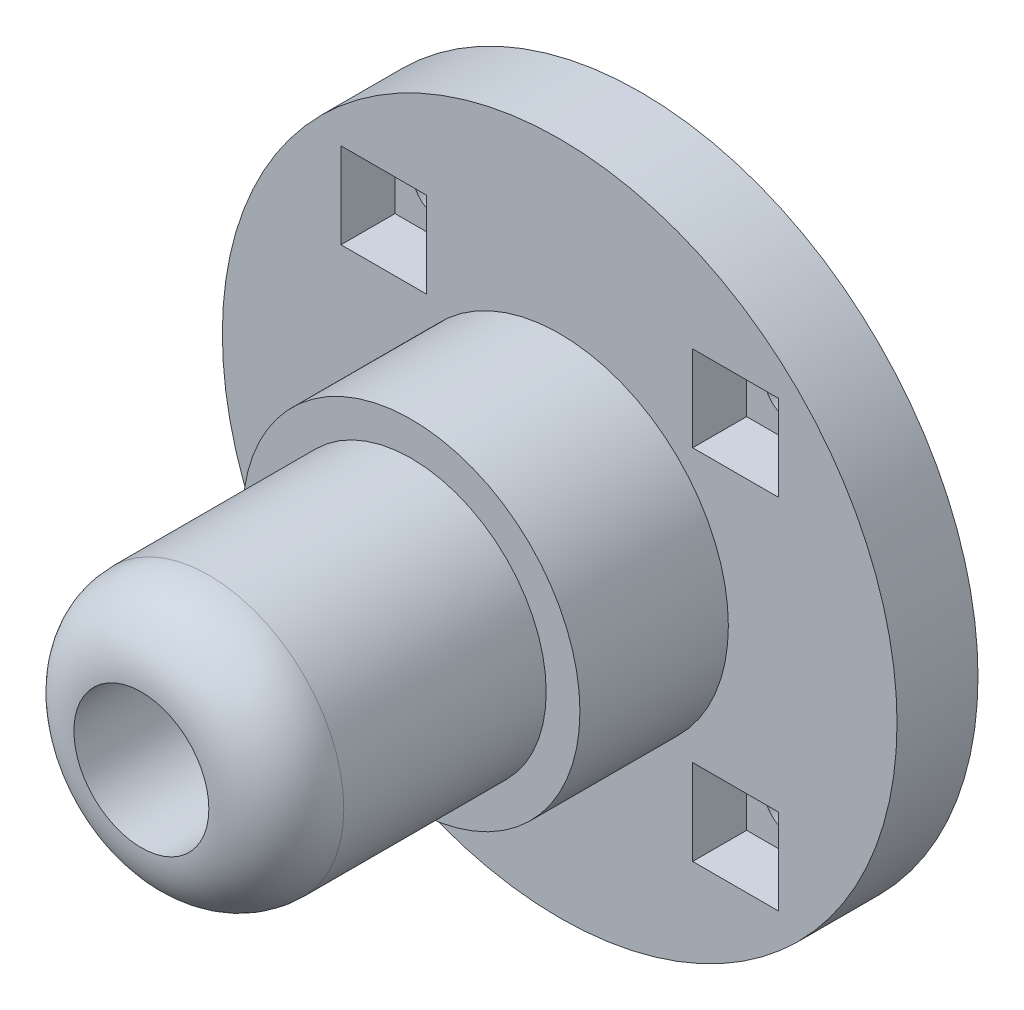
ISO-10303-21;
HEADER;
FILE_DESCRIPTION(('STEP AP214'),'2;1');
FILE_NAME('part.step','',(''),(''),'','','');
FILE_SCHEMA(('AUTOMOTIVE_DESIGN { 1 0 10303 214 1 1 1 1 }'));
ENDSEC;
DATA;
#1=APPLICATION_CONTEXT('core data for automotive mechanical design processes');
#2=APPLICATION_PROTOCOL_DEFINITION('international standard','automotive_design',2000,#1);
#3=PRODUCT_CONTEXT('',#1,'mechanical');
#4=PRODUCT('Part','Part','',(#3));
#5=PRODUCT_RELATED_PRODUCT_CATEGORY('part','',(#4));
#6=PRODUCT_DEFINITION_FORMATION('','',#4);
#7=PRODUCT_DEFINITION_CONTEXT('part definition',#1,'design');
#8=PRODUCT_DEFINITION('design','',#6,#7);
#9=PRODUCT_DEFINITION_SHAPE('','',#8);
#10=(LENGTH_UNIT() NAMED_UNIT(*) SI_UNIT(.MILLI.,.METRE.));
#11=(NAMED_UNIT(*) PLANE_ANGLE_UNIT() SI_UNIT($,.RADIAN.));
#12=(NAMED_UNIT(*) SI_UNIT($,.STERADIAN.) SOLID_ANGLE_UNIT());
#13=UNCERTAINTY_MEASURE_WITH_UNIT(LENGTH_MEASURE(1.E-05),#10,'distance_accuracy_value','');
#14=(GEOMETRIC_REPRESENTATION_CONTEXT(3) GLOBAL_UNCERTAINTY_ASSIGNED_CONTEXT((#13)) GLOBAL_UNIT_ASSIGNED_CONTEXT((#10,
#11,#12)) REPRESENTATION_CONTEXT('',''));
#15=CARTESIAN_POINT('',(0.,0.,0.));
#16=DIRECTION('',(0.,0.,1.));
#17=DIRECTION('',(1.,0.,0.));
#18=AXIS2_PLACEMENT_3D('',#15,#16,#17);
#19=CARTESIAN_POINT('',(-13.0294986716924,-13.2747984248508,6.));
#20=DIRECTION('',(0.,0.,-1.));
#21=DIRECTION('',(-1.,0.,0.));
#22=AXIS2_PLACEMENT_3D('',#19,#20,#21);
#23=CYLINDRICAL_SURFACE('',#22,1.85);
#24=CARTESIAN_POINT('',(-13.0294986716924,-13.2747984248508,0.));
#25=DIRECTION('',(0.,0.,1.));
#26=DIRECTION('',(1.,0.,0.));
#27=AXIS2_PLACEMENT_3D('',#24,#25,#26);
#28=CIRCLE('',#27,1.85);
#29=CARTESIAN_POINT('',(-11.1794986716924,-13.2747984248508,0.));
#30=VERTEX_POINT('',#29);
#31=EDGE_CURVE('E328',#30,#30,#28,.T.);
#32=ORIENTED_EDGE('',*,*,#31,.F.);
#33=EDGE_LOOP('',(#32));
#34=FACE_BOUND('',#33,.T.);
#35=CARTESIAN_POINT('',(-13.0294986716924,-13.2747984248508,2.));
#36=DIRECTION('',(0.,0.,1.));
#37=DIRECTION('',(1.,0.,0.));
#38=AXIS2_PLACEMENT_3D('',#35,#36,#37);
#39=CIRCLE('',#38,1.85);
#40=CARTESIAN_POINT('',(-11.1794986716924,-13.2747984248508,2.));
#41=VERTEX_POINT('',#40);
#42=EDGE_CURVE('E67',#41,#41,#39,.T.);
#43=ORIENTED_EDGE('',*,*,#42,.T.);
#44=EDGE_LOOP('',(#43));
#45=FACE_BOUND('',#44,.T.);
#46=ADVANCED_FACE('F63',(#34,#45),#23,.F.);
#47=CARTESIAN_POINT('',(13.0294986716924,13.2747984248508,6.));
#48=DIRECTION('',(0.,0.,-1.));
#49=DIRECTION('',(-1.,0.,0.));
#50=AXIS2_PLACEMENT_3D('',#47,#48,#49);
#51=CYLINDRICAL_SURFACE('',#50,1.85);
#52=CARTESIAN_POINT('',(13.0294986716924,13.2747984248508,0.));
#53=DIRECTION('',(0.,0.,1.));
#54=DIRECTION('',(1.,0.,0.));
#55=AXIS2_PLACEMENT_3D('',#52,#53,#54);
#56=CIRCLE('',#55,1.85);
#57=CARTESIAN_POINT('',(14.8794986716924,13.2747984248508,0.));
#58=VERTEX_POINT('',#57);
#59=EDGE_CURVE('E334',#58,#58,#56,.T.);
#60=ORIENTED_EDGE('',*,*,#59,.F.);
#61=EDGE_LOOP('',(#60));
#62=FACE_BOUND('',#61,.T.);
#63=CARTESIAN_POINT('',(13.0294986716924,13.2747984248508,2.));
#64=DIRECTION('',(0.,0.,1.));
#65=DIRECTION('',(1.,0.,0.));
#66=AXIS2_PLACEMENT_3D('',#63,#64,#65);
#67=CIRCLE('',#66,1.85);
#68=CARTESIAN_POINT('',(14.8794986716924,13.2747984248508,2.));
#69=VERTEX_POINT('',#68);
#70=EDGE_CURVE('E273',#69,#69,#67,.T.);
#71=ORIENTED_EDGE('',*,*,#70,.T.);
#72=EDGE_LOOP('',(#71));
#73=FACE_BOUND('',#72,.T.);
#74=ADVANCED_FACE('F395',(#62,#73),#51,.F.);
#75=CARTESIAN_POINT('',(0.,0.,17.));
#76=DIRECTION('',(0.,0.,1.));
#77=DIRECTION('',(1.,0.,0.));
#78=AXIS2_PLACEMENT_3D('',#75,#76,#77);
#79=PLANE('',#78);
#80=CARTESIAN_POINT('',(0.,0.,17.));
#81=DIRECTION('',(0.,0.,1.));
#82=DIRECTION('',(1.,0.,0.));
#83=AXIS2_PLACEMENT_3D('',#80,#81,#82);
#84=CIRCLE('',#83,12.5);
#85=CARTESIAN_POINT('',(12.5,0.,17.));
#86=VERTEX_POINT('',#85);
#87=EDGE_CURVE('E320',#86,#86,#84,.T.);
#88=ORIENTED_EDGE('',*,*,#87,.T.);
#89=EDGE_LOOP('',(#88));
#90=FACE_BOUND('',#89,.T.);
#91=CARTESIAN_POINT('',(0.,0.,17.));
#92=DIRECTION('',(0.,0.,1.));
#93=DIRECTION('',(1.,0.,0.));
#94=AXIS2_PLACEMENT_3D('',#91,#92,#93);
#95=CIRCLE('',#94,10.);
#96=CARTESIAN_POINT('',(10.,0.,17.));
#97=VERTEX_POINT('',#96);
#98=EDGE_CURVE('E316',#97,#97,#95,.T.);
#99=ORIENTED_EDGE('',*,*,#98,.F.);
#100=EDGE_LOOP('',(#99));
#101=FACE_BOUND('',#100,.T.);
#102=ADVANCED_FACE('F401',(#90,#101),#79,.T.);
#103=CARTESIAN_POINT('',(0.,0.,6.));
#104=DIRECTION('',(0.,0.,1.));
#105=DIRECTION('',(1.,0.,0.));
#106=AXIS2_PLACEMENT_3D('',#103,#104,#105);
#107=PLANE('',#106);
#108=DIRECTION('',(0.,-1.,0.));
#109=VECTOR('',#108,1.);
#110=CARTESIAN_POINT('',(-16.2044986716924,-10.0997984248508,6.));
#111=LINE('',#110,#109);
#112=CARTESIAN_POINT('',(-16.2044986716924,-10.0997984248508,6.));
#113=VERTEX_POINT('',#112);
#114=CARTESIAN_POINT('',(-16.2044986716924,-16.4497984248508,6.));
#115=VERTEX_POINT('',#114);
#116=EDGE_CURVE('E80',#113,#115,#111,.T.);
#117=ORIENTED_EDGE('',*,*,#116,.F.);
#118=DIRECTION('',(-1.,0.,0.));
#119=VECTOR('',#118,1.);
#120=CARTESIAN_POINT('',(-16.2044986716924,-10.0997984248508,6.));
#121=LINE('',#120,#119);
#122=CARTESIAN_POINT('',(-9.85449867169244,-10.0997984248508,6.));
#123=VERTEX_POINT('',#122);
#124=EDGE_CURVE('E198',#123,#113,#121,.T.);
#125=ORIENTED_EDGE('',*,*,#124,.F.);
#126=DIRECTION('',(0.,1.,0.));
#127=VECTOR('',#126,1.);
#128=CARTESIAN_POINT('',(-9.85449867169244,-10.0997984248508,6.));
#129=LINE('',#128,#127);
#130=CARTESIAN_POINT('',(-9.85449867169244,-16.4497984248508,6.));
#131=VERTEX_POINT('',#130);
#132=EDGE_CURVE('E201',#131,#123,#129,.T.);
#133=ORIENTED_EDGE('',*,*,#132,.F.);
#134=DIRECTION('',(1.,0.,0.));
#135=VECTOR('',#134,1.);
#136=CARTESIAN_POINT('',(-16.2044986716924,-16.4497984248508,6.));
#137=LINE('',#136,#135);
#138=EDGE_CURVE('E207',#115,#131,#137,.T.);
#139=ORIENTED_EDGE('',*,*,#138,.F.);
#140=EDGE_LOOP('',(#117,#125,#133,#139));
#141=FACE_BOUND('',#140,.T.);
#142=DIRECTION('',(0.,-1.,0.));
#143=VECTOR('',#142,1.);
#144=CARTESIAN_POINT('',(-16.2044986716924,10.0997984248508,6.));
#145=LINE('',#144,#143);
#146=CARTESIAN_POINT('',(-16.2044986716924,16.4497984248508,6.));
#147=VERTEX_POINT('',#146);
#148=CARTESIAN_POINT('',(-16.2044986716924,10.0997984248508,6.));
#149=VERTEX_POINT('',#148);
#150=EDGE_CURVE('E88',#147,#149,#145,.T.);
#151=ORIENTED_EDGE('',*,*,#150,.F.);
#152=DIRECTION('',(-1.,0.,0.));
#153=VECTOR('',#152,1.);
#154=CARTESIAN_POINT('',(-16.2044986716924,16.4497984248508,6.));
#155=LINE('',#154,#153);
#156=CARTESIAN_POINT('',(-9.85449867169244,16.4497984248508,6.));
#157=VERTEX_POINT('',#156);
#158=EDGE_CURVE('E220',#157,#147,#155,.T.);
#159=ORIENTED_EDGE('',*,*,#158,.F.);
#160=DIRECTION('',(0.,1.,0.));
#161=VECTOR('',#160,1.);
#162=CARTESIAN_POINT('',(-9.85449867169244,10.0997984248508,6.));
#163=LINE('',#162,#161);
#164=CARTESIAN_POINT('',(-9.85449867169244,10.0997984248508,6.));
#165=VERTEX_POINT('',#164);
#166=EDGE_CURVE('E234',#165,#157,#163,.T.);
#167=ORIENTED_EDGE('',*,*,#166,.F.);
#168=DIRECTION('',(1.,0.,0.));
#169=VECTOR('',#168,1.);
#170=CARTESIAN_POINT('',(-16.2044986716924,10.0997984248508,6.));
#171=LINE('',#170,#169);
#172=EDGE_CURVE('E231',#149,#165,#171,.T.);
#173=ORIENTED_EDGE('',*,*,#172,.F.);
#174=EDGE_LOOP('',(#151,#159,#167,#173));
#175=FACE_BOUND('',#174,.T.);
#176=DIRECTION('',(0.,1.,0.));
#177=VECTOR('',#176,1.);
#178=CARTESIAN_POINT('',(16.2044986716924,10.0997984248508,6.));
#179=LINE('',#178,#177);
#180=CARTESIAN_POINT('',(16.2044986716924,10.0997984248508,6.));
#181=VERTEX_POINT('',#180);
#182=CARTESIAN_POINT('',(16.2044986716924,16.4497984248508,6.));
#183=VERTEX_POINT('',#182);
#184=EDGE_CURVE('E261',#181,#183,#179,.T.);
#185=ORIENTED_EDGE('',*,*,#184,.F.);
#186=DIRECTION('',(1.,0.,0.));
#187=VECTOR('',#186,1.);
#188=CARTESIAN_POINT('',(16.2044986716924,10.0997984248508,6.));
#189=LINE('',#188,#187);
#190=CARTESIAN_POINT('',(9.85449867169244,10.0997984248508,6.));
#191=VERTEX_POINT('',#190);
#192=EDGE_CURVE('E251',#191,#181,#189,.T.);
#193=ORIENTED_EDGE('',*,*,#192,.F.);
#194=DIRECTION('',(0.,-1.,0.));
#195=VECTOR('',#194,1.);
#196=CARTESIAN_POINT('',(9.85449867169244,10.0997984248508,6.));
#197=LINE('',#196,#195);
#198=CARTESIAN_POINT('',(9.85449867169244,16.4497984248508,6.));
#199=VERTEX_POINT('',#198);
#200=EDGE_CURVE('E266',#199,#191,#197,.T.);
#201=ORIENTED_EDGE('',*,*,#200,.F.);
#202=DIRECTION('',(-1.,0.,0.));
#203=VECTOR('',#202,1.);
#204=CARTESIAN_POINT('',(16.2044986716924,16.4497984248508,6.));
#205=LINE('',#204,#203);
#206=EDGE_CURVE('E263',#183,#199,#205,.T.);
#207=ORIENTED_EDGE('',*,*,#206,.F.);
#208=EDGE_LOOP('',(#185,#193,#201,#207));
#209=FACE_BOUND('',#208,.T.);
#210=DIRECTION('',(0.,-1.,0.));
#211=VECTOR('',#210,1.);
#212=CARTESIAN_POINT('',(9.85449867169244,-10.0997984248508,6.));
#213=LINE('',#212,#211);
#214=CARTESIAN_POINT('',(9.85449867169244,-10.0997984248508,6.));
#215=VERTEX_POINT('',#214);
#216=CARTESIAN_POINT('',(9.85449867169244,-16.4497984248508,6.));
#217=VERTEX_POINT('',#216);
#218=EDGE_CURVE('E294',#215,#217,#213,.T.);
#219=ORIENTED_EDGE('',*,*,#218,.F.);
#220=DIRECTION('',(-1.,0.,0.));
#221=VECTOR('',#220,1.);
#222=CARTESIAN_POINT('',(16.2044986716924,-10.0997984248508,6.));
#223=LINE('',#222,#221);
#224=CARTESIAN_POINT('',(16.2044986716924,-10.0997984248508,6.));
#225=VERTEX_POINT('',#224);
#226=EDGE_CURVE('E284',#225,#215,#223,.T.);
#227=ORIENTED_EDGE('',*,*,#226,.F.);
#228=DIRECTION('',(0.,1.,0.));
#229=VECTOR('',#228,1.);
#230=CARTESIAN_POINT('',(16.2044986716924,-10.0997984248508,6.));
#231=LINE('',#230,#229);
#232=CARTESIAN_POINT('',(16.2044986716924,-16.4497984248508,6.));
#233=VERTEX_POINT('',#232);
#234=EDGE_CURVE('E299',#233,#225,#231,.T.);
#235=ORIENTED_EDGE('',*,*,#234,.F.);
#236=DIRECTION('',(1.,0.,0.));
#237=VECTOR('',#236,1.);
#238=CARTESIAN_POINT('',(16.2044986716924,-16.4497984248508,6.));
#239=LINE('',#238,#237);
#240=EDGE_CURVE('E296',#217,#233,#239,.T.);
#241=ORIENTED_EDGE('',*,*,#240,.F.);
#242=EDGE_LOOP('',(#219,#227,#235,#241));
#243=FACE_BOUND('',#242,.T.);
#244=CARTESIAN_POINT('',(0.,0.,6.));
#245=DIRECTION('',(0.,0.,1.));
#246=DIRECTION('',(1.,0.,0.));
#247=AXIS2_PLACEMENT_3D('',#244,#245,#246);
#248=CIRCLE('',#247,24.9999999999998);
#249=CARTESIAN_POINT('',(24.9999999999998,0.,6.));
#250=VERTEX_POINT('',#249);
#251=EDGE_CURVE('E72',#250,#250,#248,.T.);
#252=ORIENTED_EDGE('',*,*,#251,.T.);
#253=EDGE_LOOP('',(#252));
#254=FACE_BOUND('',#253,.T.);
#255=CARTESIAN_POINT('',(0.,0.,6.));
#256=DIRECTION('',(0.,0.,1.));
#257=DIRECTION('',(1.,0.,0.));
#258=AXIS2_PLACEMENT_3D('',#255,#256,#257);
#259=CIRCLE('',#258,12.5);
#260=CARTESIAN_POINT('',(12.5,0.,6.));
#261=VERTEX_POINT('',#260);
#262=EDGE_CURVE('E319',#261,#261,#259,.T.);
#263=ORIENTED_EDGE('',*,*,#262,.F.);
#264=EDGE_LOOP('',(#263));
#265=FACE_BOUND('',#264,.T.);
#266=ADVANCED_FACE('F366',(#141,#175,#209,#243,#254,#265),#107,.T.);
#267=CARTESIAN_POINT('',(0.,0.,0.));
#268=DIRECTION('',(0.,0.,1.));
#269=DIRECTION('',(1.,0.,0.));
#270=AXIS2_PLACEMENT_3D('',#267,#268,#269);
#271=PLANE('',#270);
#272=CARTESIAN_POINT('',(0.,0.,0.));
#273=DIRECTION('',(0.,0.,1.));
#274=DIRECTION('',(1.,0.,0.));
#275=AXIS2_PLACEMENT_3D('',#272,#273,#274);
#276=CIRCLE('',#275,24.9999999999998);
#277=CARTESIAN_POINT('',(24.9999999999998,0.,0.));
#278=VERTEX_POINT('',#277);
#279=EDGE_CURVE('E340',#278,#278,#276,.T.);
#280=ORIENTED_EDGE('',*,*,#279,.F.);
#281=EDGE_LOOP('',(#280));
#282=FACE_BOUND('',#281,.T.);
#283=CARTESIAN_POINT('',(13.0294986716924,-13.2747984248508,0.));
#284=DIRECTION('',(0.,0.,1.));
#285=DIRECTION('',(1.,0.,0.));
#286=AXIS2_PLACEMENT_3D('',#283,#284,#285);
#287=CIRCLE('',#286,1.85);
#288=CARTESIAN_POINT('',(14.8794986716924,-13.2747984248508,0.));
#289=VERTEX_POINT('',#288);
#290=EDGE_CURVE('E337',#289,#289,#287,.T.);
#291=ORIENTED_EDGE('',*,*,#290,.T.);
#292=EDGE_LOOP('',(#291));
#293=FACE_BOUND('',#292,.T.);
#294=ORIENTED_EDGE('',*,*,#59,.T.);
#295=EDGE_LOOP('',(#294));
#296=FACE_BOUND('',#295,.T.);
#297=CARTESIAN_POINT('',(-13.0294986716924,13.2747984248508,0.));
#298=DIRECTION('',(0.,0.,1.));
#299=DIRECTION('',(1.,0.,0.));
#300=AXIS2_PLACEMENT_3D('',#297,#298,#299);
#301=CIRCLE('',#300,1.85);
#302=CARTESIAN_POINT('',(-11.1794986716924,13.2747984248508,0.));
#303=VERTEX_POINT('',#302);
#304=EDGE_CURVE('E331',#303,#303,#301,.T.);
#305=ORIENTED_EDGE('',*,*,#304,.T.);
#306=EDGE_LOOP('',(#305));
#307=FACE_BOUND('',#306,.T.);
#308=ORIENTED_EDGE('',*,*,#31,.T.);
#309=EDGE_LOOP('',(#308));
#310=FACE_BOUND('',#309,.T.);
#311=CARTESIAN_POINT('',(0.,0.,0.));
#312=DIRECTION('',(0.,0.,1.));
#313=DIRECTION('',(1.,0.,0.));
#314=AXIS2_PLACEMENT_3D('',#311,#312,#313);
#315=CIRCLE('',#314,5.);
#316=CARTESIAN_POINT('',(5.,0.,0.));
#317=VERTEX_POINT('',#316);
#318=EDGE_CURVE('E323',#317,#317,#315,.T.);
#319=ORIENTED_EDGE('',*,*,#318,.T.);
#320=EDGE_LOOP('',(#319));
#321=FACE_BOUND('',#320,.T.);
#322=ADVANCED_FACE('F362',(#282,#293,#296,#307,#310,#321),#271,.F.);
#323=CARTESIAN_POINT('',(0.,0.,6.));
#324=DIRECTION('',(0.,0.,-1.));
#325=DIRECTION('',(-1.,0.,0.));
#326=AXIS2_PLACEMENT_3D('',#323,#324,#325);
#327=CYLINDRICAL_SURFACE('',#326,24.9999999999998);
#328=ORIENTED_EDGE('',*,*,#251,.F.);
#329=EDGE_LOOP('',(#328));
#330=FACE_BOUND('',#329,.T.);
#331=ORIENTED_EDGE('',*,*,#279,.T.);
#332=EDGE_LOOP('',(#331));
#333=FACE_BOUND('',#332,.T.);
#334=ADVANCED_FACE('F365',(#330,#333),#327,.T.);
#335=CARTESIAN_POINT('',(13.0294986716924,-13.2747984248508,6.));
#336=DIRECTION('',(0.,0.,-1.));
#337=DIRECTION('',(-1.,0.,0.));
#338=AXIS2_PLACEMENT_3D('',#335,#336,#337);
#339=CYLINDRICAL_SURFACE('',#338,1.85);
#340=CARTESIAN_POINT('',(13.0294986716924,-13.2747984248508,2.));
#341=DIRECTION('',(0.,0.,-1.));
#342=DIRECTION('',(-1.,0.,0.));
#343=AXIS2_PLACEMENT_3D('',#340,#341,#342);
#344=CIRCLE('',#343,1.85);
#345=CARTESIAN_POINT('',(11.1794986716924,-13.2747984248508,2.));
#346=VERTEX_POINT('',#345);
#347=EDGE_CURVE('E306',#346,#346,#344,.T.);
#348=ORIENTED_EDGE('',*,*,#347,.F.);
#349=EDGE_LOOP('',(#348));
#350=FACE_BOUND('',#349,.T.);
#351=ORIENTED_EDGE('',*,*,#290,.F.);
#352=EDGE_LOOP('',(#351));
#353=FACE_BOUND('',#352,.T.);
#354=ADVANCED_FACE('F358',(#350,#353),#339,.F.);
#355=CARTESIAN_POINT('',(-13.0294986716924,13.2747984248508,6.));
#356=DIRECTION('',(0.,0.,-1.));
#357=DIRECTION('',(-1.,0.,0.));
#358=AXIS2_PLACEMENT_3D('',#355,#356,#357);
#359=CYLINDRICAL_SURFACE('',#358,1.85);
#360=CARTESIAN_POINT('',(-13.0294986716924,13.2747984248508,2.));
#361=DIRECTION('',(0.,0.,-1.));
#362=DIRECTION('',(-1.,0.,0.));
#363=AXIS2_PLACEMENT_3D('',#360,#361,#362);
#364=CIRCLE('',#363,1.85);
#365=CARTESIAN_POINT('',(-14.8794986716924,13.2747984248508,2.));
#366=VERTEX_POINT('',#365);
#367=EDGE_CURVE('E241',#366,#366,#364,.T.);
#368=ORIENTED_EDGE('',*,*,#367,.F.);
#369=EDGE_LOOP('',(#368));
#370=FACE_BOUND('',#369,.T.);
#371=ORIENTED_EDGE('',*,*,#304,.F.);
#372=EDGE_LOOP('',(#371));
#373=FACE_BOUND('',#372,.T.);
#374=ADVANCED_FACE('F354',(#370,#373),#359,.F.);
#375=CARTESIAN_POINT('',(0.,0.,6.));
#376=DIRECTION('',(0.,0.,-1.));
#377=DIRECTION('',(-1.,0.,0.));
#378=AXIS2_PLACEMENT_3D('',#375,#376,#377);
#379=CYLINDRICAL_SURFACE('',#378,5.);
#380=ORIENTED_EDGE('',*,*,#318,.F.);
#381=EDGE_LOOP('',(#380));
#382=FACE_BOUND('',#381,.T.);
#383=CARTESIAN_POINT('',(0.,0.,37.));
#384=DIRECTION('',(0.,0.,1.));
#385=DIRECTION('',(1.,0.,0.));
#386=AXIS2_PLACEMENT_3D('',#383,#384,#385);
#387=CIRCLE('',#386,5.);
#388=CARTESIAN_POINT('',(5.,0.,37.));
#389=VERTEX_POINT('',#388);
#390=EDGE_CURVE('E313',#389,#389,#387,.T.);
#391=ORIENTED_EDGE('',*,*,#390,.T.);
#392=EDGE_LOOP('',(#391));
#393=FACE_BOUND('',#392,.T.);
#394=ADVANCED_FACE('F357',(#382,#393),#379,.F.);
#395=CARTESIAN_POINT('',(0.,0.,17.));
#396=DIRECTION('',(0.,0.,-1.));
#397=DIRECTION('',(-1.,0.,0.));
#398=AXIS2_PLACEMENT_3D('',#395,#396,#397);
#399=CYLINDRICAL_SURFACE('',#398,12.5);
#400=ORIENTED_EDGE('',*,*,#87,.F.);
#401=EDGE_LOOP('',(#400));
#402=FACE_BOUND('',#401,.T.);
#403=ORIENTED_EDGE('',*,*,#262,.T.);
#404=EDGE_LOOP('',(#403));
#405=FACE_BOUND('',#404,.T.);
#406=ADVANCED_FACE('F375',(#402,#405),#399,.T.);
#407=CARTESIAN_POINT('',(0.,0.,37.));
#408=DIRECTION('',(0.,0.,-1.));
#409=DIRECTION('',(-1.,0.,0.));
#410=AXIS2_PLACEMENT_3D('',#407,#408,#409);
#411=CYLINDRICAL_SURFACE('',#410,10.);
#412=CARTESIAN_POINT('',(0.,0.,32.));
#413=DIRECTION('',(0.,0.,1.));
#414=DIRECTION('',(1.,0.,0.));
#415=AXIS2_PLACEMENT_3D('',#412,#413,#414);
#416=CIRCLE('',#415,10.);
#417=CARTESIAN_POINT('',(10.,0.,32.));
#418=VERTEX_POINT('',#417);
#419=EDGE_CURVE('E12',#418,#418,#416,.F.);
#420=ORIENTED_EDGE('',*,*,#419,.T.);
#421=EDGE_LOOP('',(#420));
#422=FACE_BOUND('',#421,.T.);
#423=ORIENTED_EDGE('',*,*,#98,.T.);
#424=EDGE_LOOP('',(#423));
#425=FACE_BOUND('',#424,.T.);
#426=ADVANCED_FACE('F381',(#422,#425),#411,.T.);
#427=CARTESIAN_POINT('',(0.,0.,32.));
#428=DIRECTION('',(0.,0.,1.));
#429=DIRECTION('',(1.,0.,0.));
#430=AXIS2_PLACEMENT_3D('',#427,#428,#429);
#431=DEGENERATE_TOROIDAL_SURFACE('',#430,5.,5.,.T.);
#432=ORIENTED_EDGE('',*,*,#419,.F.);
#433=EDGE_LOOP('',(#432));
#434=FACE_BOUND('',#433,.T.);
#435=ORIENTED_EDGE('',*,*,#390,.F.);
#436=EDGE_LOOP('',(#435));
#437=FACE_BOUND('',#436,.T.);
#438=ADVANCED_FACE('F65',(#434,#437),#431,.T.);
#439=CARTESIAN_POINT('',(9.85449867169244,-10.0997984248508,2.));
#440=DIRECTION('',(-1.,0.,0.));
#441=DIRECTION('',(0.,-1.,0.));
#442=AXIS2_PLACEMENT_3D('',#439,#440,#441);
#443=PLANE('',#442);
#444=ORIENTED_EDGE('',*,*,#218,.T.);
#445=DIRECTION('',(0.,0.,1.));
#446=VECTOR('',#445,1.);
#447=CARTESIAN_POINT('',(9.85449867169244,-16.4497984248508,2.));
#448=LINE('',#447,#446);
#449=CARTESIAN_POINT('',(9.85449867169244,-16.4497984248508,2.));
#450=VERTEX_POINT('',#449);
#451=EDGE_CURVE('E293',#450,#217,#448,.T.);
#452=ORIENTED_EDGE('',*,*,#451,.F.);
#453=DIRECTION('',(0.,-1.,0.));
#454=VECTOR('',#453,1.);
#455=CARTESIAN_POINT('',(9.85449867169244,-10.0997984248508,2.));
#456=LINE('',#455,#454);
#457=CARTESIAN_POINT('',(9.85449867169244,-10.0997984248508,2.));
#458=VERTEX_POINT('',#457);
#459=EDGE_CURVE('E280',#458,#450,#456,.T.);
#460=ORIENTED_EDGE('',*,*,#459,.F.);
#461=DIRECTION('',(0.,0.,1.));
#462=VECTOR('',#461,1.);
#463=CARTESIAN_POINT('',(9.85449867169244,-10.0997984248508,2.));
#464=LINE('',#463,#462);
#465=EDGE_CURVE('E304',#458,#215,#464,.T.);
#466=ORIENTED_EDGE('',*,*,#465,.T.);
#467=EDGE_LOOP('',(#444,#452,#460,#466));
#468=FACE_BOUND('',#467,.T.);
#469=ADVANCED_FACE('F380',(#468),#443,.F.);
#470=CARTESIAN_POINT('',(16.2044986716924,-10.0997984248508,2.));
#471=DIRECTION('',(0.,1.,0.));
#472=DIRECTION('',(-1.,0.,0.));
#473=AXIS2_PLACEMENT_3D('',#470,#471,#472);
#474=PLANE('',#473);
#475=ORIENTED_EDGE('',*,*,#226,.T.);
#476=ORIENTED_EDGE('',*,*,#465,.F.);
#477=DIRECTION('',(-1.,0.,0.));
#478=VECTOR('',#477,1.);
#479=CARTESIAN_POINT('',(16.2044986716924,-10.0997984248508,2.));
#480=LINE('',#479,#478);
#481=CARTESIAN_POINT('',(16.2044986716924,-10.0997984248508,2.));
#482=VERTEX_POINT('',#481);
#483=EDGE_CURVE('E290',#482,#458,#480,.T.);
#484=ORIENTED_EDGE('',*,*,#483,.F.);
#485=DIRECTION('',(0.,0.,1.));
#486=VECTOR('',#485,1.);
#487=CARTESIAN_POINT('',(16.2044986716924,-10.0997984248508,2.));
#488=LINE('',#487,#486);
#489=EDGE_CURVE('E307',#482,#225,#488,.T.);
#490=ORIENTED_EDGE('',*,*,#489,.T.);
#491=EDGE_LOOP('',(#475,#476,#484,#490));
#492=FACE_BOUND('',#491,.T.);
#493=ADVANCED_FACE('F388',(#492),#474,.F.);
#494=CARTESIAN_POINT('',(16.2044986716924,-10.0997984248508,2.));
#495=DIRECTION('',(1.,0.,0.));
#496=DIRECTION('',(0.,1.,0.));
#497=AXIS2_PLACEMENT_3D('',#494,#495,#496);
#498=PLANE('',#497);
#499=ORIENTED_EDGE('',*,*,#234,.T.);
#500=ORIENTED_EDGE('',*,*,#489,.F.);
#501=DIRECTION('',(0.,1.,0.));
#502=VECTOR('',#501,1.);
#503=CARTESIAN_POINT('',(16.2044986716924,-10.0997984248508,2.));
#504=LINE('',#503,#502);
#505=CARTESIAN_POINT('',(16.2044986716924,-16.4497984248508,2.));
#506=VERTEX_POINT('',#505);
#507=EDGE_CURVE('E287',#506,#482,#504,.T.);
#508=ORIENTED_EDGE('',*,*,#507,.F.);
#509=DIRECTION('',(0.,0.,1.));
#510=VECTOR('',#509,1.);
#511=CARTESIAN_POINT('',(16.2044986716924,-16.4497984248508,2.));
#512=LINE('',#511,#510);
#513=EDGE_CURVE('E309',#506,#233,#512,.T.);
#514=ORIENTED_EDGE('',*,*,#513,.T.);
#515=EDGE_LOOP('',(#499,#500,#508,#514));
#516=FACE_BOUND('',#515,.T.);
#517=ADVANCED_FACE('F470',(#516),#498,.F.);
#518=CARTESIAN_POINT('',(16.2044986716924,-16.4497984248508,2.));
#519=DIRECTION('',(0.,-1.,0.));
#520=DIRECTION('',(0.,0.,-1.));
#521=AXIS2_PLACEMENT_3D('',#518,#519,#520);
#522=PLANE('',#521);
#523=ORIENTED_EDGE('',*,*,#240,.T.);
#524=ORIENTED_EDGE('',*,*,#513,.F.);
#525=DIRECTION('',(1.,0.,0.));
#526=VECTOR('',#525,1.);
#527=CARTESIAN_POINT('',(16.2044986716924,-16.4497984248508,2.));
#528=LINE('',#527,#526);
#529=EDGE_CURVE('E283',#450,#506,#528,.T.);
#530=ORIENTED_EDGE('',*,*,#529,.F.);
#531=ORIENTED_EDGE('',*,*,#451,.T.);
#532=EDGE_LOOP('',(#523,#524,#530,#531));
#533=FACE_BOUND('',#532,.T.);
#534=ADVANCED_FACE('F466',(#533),#522,.F.);
#535=CARTESIAN_POINT('',(0.,0.,2.));
#536=DIRECTION('',(0.,0.,-1.));
#537=DIRECTION('',(-1.,0.,0.));
#538=AXIS2_PLACEMENT_3D('',#535,#536,#537);
#539=PLANE('',#538);
#540=ORIENTED_EDGE('',*,*,#347,.T.);
#541=EDGE_LOOP('',(#540));
#542=FACE_BOUND('',#541,.T.);
#543=ORIENTED_EDGE('',*,*,#459,.T.);
#544=ORIENTED_EDGE('',*,*,#529,.T.);
#545=ORIENTED_EDGE('',*,*,#507,.T.);
#546=ORIENTED_EDGE('',*,*,#483,.T.);
#547=EDGE_LOOP('',(#543,#544,#545,#546));
#548=FACE_BOUND('',#547,.T.);
#549=ADVANCED_FACE('F469',(#542,#548),#539,.F.);
#550=CARTESIAN_POINT('',(16.2044986716924,10.0997984248508,2.));
#551=DIRECTION('',(1.,0.,0.));
#552=DIRECTION('',(0.,1.,0.));
#553=AXIS2_PLACEMENT_3D('',#550,#551,#552);
#554=PLANE('',#553);
#555=ORIENTED_EDGE('',*,*,#184,.T.);
#556=DIRECTION('',(0.,0.,1.));
#557=VECTOR('',#556,1.);
#558=CARTESIAN_POINT('',(16.2044986716924,16.4497984248508,2.));
#559=LINE('',#558,#557);
#560=CARTESIAN_POINT('',(16.2044986716924,16.4497984248508,2.));
#561=VERTEX_POINT('',#560);
#562=EDGE_CURVE('E260',#561,#183,#559,.T.);
#563=ORIENTED_EDGE('',*,*,#562,.F.);
#564=DIRECTION('',(0.,1.,0.));
#565=VECTOR('',#564,1.);
#566=CARTESIAN_POINT('',(16.2044986716924,10.0997984248508,2.));
#567=LINE('',#566,#565);
#568=CARTESIAN_POINT('',(16.2044986716924,10.0997984248508,2.));
#569=VERTEX_POINT('',#568);
#570=EDGE_CURVE('E247',#569,#561,#567,.T.);
#571=ORIENTED_EDGE('',*,*,#570,.F.);
#572=DIRECTION('',(0.,0.,1.));
#573=VECTOR('',#572,1.);
#574=CARTESIAN_POINT('',(16.2044986716924,10.0997984248508,2.));
#575=LINE('',#574,#573);
#576=EDGE_CURVE('E271',#569,#181,#575,.T.);
#577=ORIENTED_EDGE('',*,*,#576,.T.);
#578=EDGE_LOOP('',(#555,#563,#571,#577));
#579=FACE_BOUND('',#578,.T.);
#580=ADVANCED_FACE('F437',(#579),#554,.F.);
#581=CARTESIAN_POINT('',(16.2044986716924,10.0997984248508,2.));
#582=DIRECTION('',(0.,-1.,0.));
#583=DIRECTION('',(1.,0.,0.));
#584=AXIS2_PLACEMENT_3D('',#581,#582,#583);
#585=PLANE('',#584);
#586=ORIENTED_EDGE('',*,*,#192,.T.);
#587=ORIENTED_EDGE('',*,*,#576,.F.);
#588=DIRECTION('',(1.,0.,0.));
#589=VECTOR('',#588,1.);
#590=CARTESIAN_POINT('',(16.2044986716924,10.0997984248508,2.));
#591=LINE('',#590,#589);
#592=CARTESIAN_POINT('',(9.85449867169244,10.0997984248508,2.));
#593=VERTEX_POINT('',#592);
#594=EDGE_CURVE('E257',#593,#569,#591,.T.);
#595=ORIENTED_EDGE('',*,*,#594,.F.);
#596=DIRECTION('',(0.,0.,1.));
#597=VECTOR('',#596,1.);
#598=CARTESIAN_POINT('',(9.85449867169244,10.0997984248508,2.));
#599=LINE('',#598,#597);
#600=EDGE_CURVE('E274',#593,#191,#599,.T.);
#601=ORIENTED_EDGE('',*,*,#600,.T.);
#602=EDGE_LOOP('',(#586,#587,#595,#601));
#603=FACE_BOUND('',#602,.T.);
#604=ADVANCED_FACE('F446',(#603),#585,.F.);
#605=CARTESIAN_POINT('',(9.85449867169244,10.0997984248508,2.));
#606=DIRECTION('',(-1.,0.,0.));
#607=DIRECTION('',(0.,-1.,0.));
#608=AXIS2_PLACEMENT_3D('',#605,#606,#607);
#609=PLANE('',#608);
#610=ORIENTED_EDGE('',*,*,#200,.T.);
#611=ORIENTED_EDGE('',*,*,#600,.F.);
#612=DIRECTION('',(0.,-1.,0.));
#613=VECTOR('',#612,1.);
#614=CARTESIAN_POINT('',(9.85449867169244,10.0997984248508,2.));
#615=LINE('',#614,#613);
#616=CARTESIAN_POINT('',(9.85449867169244,16.4497984248508,2.));
#617=VERTEX_POINT('',#616);
#618=EDGE_CURVE('E254',#617,#593,#615,.T.);
#619=ORIENTED_EDGE('',*,*,#618,.F.);
#620=DIRECTION('',(0.,0.,1.));
#621=VECTOR('',#620,1.);
#622=CARTESIAN_POINT('',(9.85449867169244,16.4497984248508,2.));
#623=LINE('',#622,#621);
#624=EDGE_CURVE('E276',#617,#199,#623,.T.);
#625=ORIENTED_EDGE('',*,*,#624,.T.);
#626=EDGE_LOOP('',(#610,#611,#619,#625));
#627=FACE_BOUND('',#626,.T.);
#628=ADVANCED_FACE('F444',(#627),#609,.F.);
#629=CARTESIAN_POINT('',(16.2044986716924,16.4497984248508,2.));
#630=DIRECTION('',(0.,1.,0.));
#631=DIRECTION('',(0.,0.,1.));
#632=AXIS2_PLACEMENT_3D('',#629,#630,#631);
#633=PLANE('',#632);
#634=ORIENTED_EDGE('',*,*,#206,.T.);
#635=ORIENTED_EDGE('',*,*,#624,.F.);
#636=DIRECTION('',(-1.,0.,0.));
#637=VECTOR('',#636,1.);
#638=CARTESIAN_POINT('',(16.2044986716924,16.4497984248508,2.));
#639=LINE('',#638,#637);
#640=EDGE_CURVE('E250',#561,#617,#639,.T.);
#641=ORIENTED_EDGE('',*,*,#640,.F.);
#642=ORIENTED_EDGE('',*,*,#562,.T.);
#643=EDGE_LOOP('',(#634,#635,#641,#642));
#644=FACE_BOUND('',#643,.T.);
#645=ADVANCED_FACE('F431',(#644),#633,.F.);
#646=CARTESIAN_POINT('',(0.,0.,2.));
#647=DIRECTION('',(0.,0.,1.));
#648=DIRECTION('',(1.,0.,0.));
#649=AXIS2_PLACEMENT_3D('',#646,#647,#648);
#650=PLANE('',#649);
#651=ORIENTED_EDGE('',*,*,#70,.F.);
#652=EDGE_LOOP('',(#651));
#653=FACE_BOUND('',#652,.T.);
#654=ORIENTED_EDGE('',*,*,#570,.T.);
#655=ORIENTED_EDGE('',*,*,#640,.T.);
#656=ORIENTED_EDGE('',*,*,#618,.T.);
#657=ORIENTED_EDGE('',*,*,#594,.T.);
#658=EDGE_LOOP('',(#654,#655,#656,#657));
#659=FACE_BOUND('',#658,.T.);
#660=ADVANCED_FACE('F427',(#653,#659),#650,.T.);
#661=CARTESIAN_POINT('',(-16.2044986716924,10.0997984248508,2.));
#662=DIRECTION('',(-1.,0.,0.));
#663=DIRECTION('',(0.,-1.,0.));
#664=AXIS2_PLACEMENT_3D('',#661,#662,#663);
#665=PLANE('',#664);
#666=ORIENTED_EDGE('',*,*,#150,.T.);
#667=DIRECTION('',(0.,0.,1.));
#668=VECTOR('',#667,1.);
#669=CARTESIAN_POINT('',(-16.2044986716924,10.0997984248508,2.));
#670=LINE('',#669,#668);
#671=CARTESIAN_POINT('',(-16.2044986716924,10.0997984248508,2.));
#672=VERTEX_POINT('',#671);
#673=EDGE_CURVE('E229',#672,#149,#670,.T.);
#674=ORIENTED_EDGE('',*,*,#673,.F.);
#675=DIRECTION('',(0.,-1.,0.));
#676=VECTOR('',#675,1.);
#677=CARTESIAN_POINT('',(-16.2044986716924,10.0997984248508,2.));
#678=LINE('',#677,#676);
#679=CARTESIAN_POINT('',(-16.2044986716924,16.4497984248508,2.));
#680=VERTEX_POINT('',#679);
#681=EDGE_CURVE('E216',#680,#672,#678,.T.);
#682=ORIENTED_EDGE('',*,*,#681,.F.);
#683=DIRECTION('',(0.,0.,1.));
#684=VECTOR('',#683,1.);
#685=CARTESIAN_POINT('',(-16.2044986716924,16.4497984248508,2.));
#686=LINE('',#685,#684);
#687=EDGE_CURVE('E239',#680,#147,#686,.T.);
#688=ORIENTED_EDGE('',*,*,#687,.T.);
#689=EDGE_LOOP('',(#666,#674,#682,#688));
#690=FACE_BOUND('',#689,.T.);
#691=ADVANCED_FACE('F430',(#690),#665,.F.);
#692=CARTESIAN_POINT('',(-16.2044986716924,16.4497984248508,2.));
#693=DIRECTION('',(0.,1.,0.));
#694=DIRECTION('',(0.,0.,1.));
#695=AXIS2_PLACEMENT_3D('',#692,#693,#694);
#696=PLANE('',#695);
#697=ORIENTED_EDGE('',*,*,#158,.T.);
#698=ORIENTED_EDGE('',*,*,#687,.F.);
#699=DIRECTION('',(-1.,0.,0.));
#700=VECTOR('',#699,1.);
#701=CARTESIAN_POINT('',(-16.2044986716924,16.4497984248508,2.));
#702=LINE('',#701,#700);
#703=CARTESIAN_POINT('',(-9.85449867169244,16.4497984248508,2.));
#704=VERTEX_POINT('',#703);
#705=EDGE_CURVE('E226',#704,#680,#702,.T.);
#706=ORIENTED_EDGE('',*,*,#705,.F.);
#707=DIRECTION('',(0.,0.,1.));
#708=VECTOR('',#707,1.);
#709=CARTESIAN_POINT('',(-9.85449867169244,16.4497984248508,2.));
#710=LINE('',#709,#708);
#711=EDGE_CURVE('E242',#704,#157,#710,.T.);
#712=ORIENTED_EDGE('',*,*,#711,.T.);
#713=EDGE_LOOP('',(#697,#698,#706,#712));
#714=FACE_BOUND('',#713,.T.);
#715=ADVANCED_FACE('F491',(#714),#696,.F.);
#716=CARTESIAN_POINT('',(-9.85449867169244,10.0997984248508,2.));
#717=DIRECTION('',(1.,0.,0.));
#718=DIRECTION('',(0.,1.,0.));
#719=AXIS2_PLACEMENT_3D('',#716,#717,#718);
#720=PLANE('',#719);
#721=ORIENTED_EDGE('',*,*,#166,.T.);
#722=ORIENTED_EDGE('',*,*,#711,.F.);
#723=DIRECTION('',(0.,1.,0.));
#724=VECTOR('',#723,1.);
#725=CARTESIAN_POINT('',(-9.85449867169244,10.0997984248508,2.));
#726=LINE('',#725,#724);
#727=CARTESIAN_POINT('',(-9.85449867169244,10.0997984248508,2.));
#728=VERTEX_POINT('',#727);
#729=EDGE_CURVE('E223',#728,#704,#726,.T.);
#730=ORIENTED_EDGE('',*,*,#729,.F.);
#731=DIRECTION('',(0.,0.,1.));
#732=VECTOR('',#731,1.);
#733=CARTESIAN_POINT('',(-9.85449867169244,10.0997984248508,2.));
#734=LINE('',#733,#732);
#735=EDGE_CURVE('E244',#728,#165,#734,.T.);
#736=ORIENTED_EDGE('',*,*,#735,.T.);
#737=EDGE_LOOP('',(#721,#722,#730,#736));
#738=FACE_BOUND('',#737,.T.);
#739=ADVANCED_FACE('F495',(#738),#720,.F.);
#740=CARTESIAN_POINT('',(-16.2044986716924,10.0997984248508,2.));
#741=DIRECTION('',(0.,-1.,0.));
#742=DIRECTION('',(1.,0.,0.));
#743=AXIS2_PLACEMENT_3D('',#740,#741,#742);
#744=PLANE('',#743);
#745=ORIENTED_EDGE('',*,*,#172,.T.);
#746=ORIENTED_EDGE('',*,*,#735,.F.);
#747=DIRECTION('',(1.,0.,0.));
#748=VECTOR('',#747,1.);
#749=CARTESIAN_POINT('',(-16.2044986716924,10.0997984248508,2.));
#750=LINE('',#749,#748);
#751=EDGE_CURVE('E219',#672,#728,#750,.T.);
#752=ORIENTED_EDGE('',*,*,#751,.F.);
#753=ORIENTED_EDGE('',*,*,#673,.T.);
#754=EDGE_LOOP('',(#745,#746,#752,#753));
#755=FACE_BOUND('',#754,.T.);
#756=ADVANCED_FACE('F492',(#755),#744,.F.);
#757=CARTESIAN_POINT('',(0.,0.,2.));
#758=DIRECTION('',(0.,0.,-1.));
#759=DIRECTION('',(-1.,0.,0.));
#760=AXIS2_PLACEMENT_3D('',#757,#758,#759);
#761=PLANE('',#760);
#762=ORIENTED_EDGE('',*,*,#367,.T.);
#763=EDGE_LOOP('',(#762));
#764=FACE_BOUND('',#763,.T.);
#765=ORIENTED_EDGE('',*,*,#681,.T.);
#766=ORIENTED_EDGE('',*,*,#751,.T.);
#767=ORIENTED_EDGE('',*,*,#729,.T.);
#768=ORIENTED_EDGE('',*,*,#705,.T.);
#769=EDGE_LOOP('',(#765,#766,#767,#768));
#770=FACE_BOUND('',#769,.T.);
#771=ADVANCED_FACE('F351',(#764,#770),#761,.F.);
#772=CARTESIAN_POINT('',(-16.2044986716924,-10.0997984248508,2.));
#773=DIRECTION('',(-1.,0.,0.));
#774=DIRECTION('',(0.,-1.,0.));
#775=AXIS2_PLACEMENT_3D('',#772,#773,#774);
#776=PLANE('',#775);
#777=ORIENTED_EDGE('',*,*,#116,.T.);
#778=DIRECTION('',(0.,0.,1.));
#779=VECTOR('',#778,1.);
#780=CARTESIAN_POINT('',(-16.2044986716924,-16.4497984248508,2.));
#781=LINE('',#780,#779);
#782=CARTESIAN_POINT('',(-16.2044986716924,-16.4497984248508,2.));
#783=VERTEX_POINT('',#782);
#784=EDGE_CURVE('E176',#783,#115,#781,.T.);
#785=ORIENTED_EDGE('',*,*,#784,.F.);
#786=DIRECTION('',(0.,-1.,0.));
#787=VECTOR('',#786,1.);
#788=CARTESIAN_POINT('',(-16.2044986716924,-10.0997984248508,2.));
#789=LINE('',#788,#787);
#790=CARTESIAN_POINT('',(-16.2044986716924,-10.0997984248508,2.));
#791=VERTEX_POINT('',#790);
#792=EDGE_CURVE('E180',#791,#783,#789,.T.);
#793=ORIENTED_EDGE('',*,*,#792,.F.);
#794=DIRECTION('',(0.,0.,1.));
#795=VECTOR('',#794,1.);
#796=CARTESIAN_POINT('',(-16.2044986716924,-10.0997984248508,2.));
#797=LINE('',#796,#795);
#798=EDGE_CURVE('E211',#791,#113,#797,.T.);
#799=ORIENTED_EDGE('',*,*,#798,.T.);
#800=EDGE_LOOP('',(#777,#785,#793,#799));
#801=FACE_BOUND('',#800,.T.);
#802=ADVANCED_FACE('F178',(#801),#776,.F.);
#803=CARTESIAN_POINT('',(-16.2044986716924,-10.0997984248508,2.));
#804=DIRECTION('',(0.,1.,0.));
#805=DIRECTION('',(-1.,0.,0.));
#806=AXIS2_PLACEMENT_3D('',#803,#804,#805);
#807=PLANE('',#806);
#808=ORIENTED_EDGE('',*,*,#124,.T.);
#809=ORIENTED_EDGE('',*,*,#798,.F.);
#810=DIRECTION('',(-1.,0.,0.));
#811=VECTOR('',#810,1.);
#812=CARTESIAN_POINT('',(-16.2044986716924,-10.0997984248508,2.));
#813=LINE('',#812,#811);
#814=CARTESIAN_POINT('',(-9.85449867169244,-10.0997984248508,2.));
#815=VERTEX_POINT('',#814);
#816=EDGE_CURVE('E186',#815,#791,#813,.T.);
#817=ORIENTED_EDGE('',*,*,#816,.F.);
#818=DIRECTION('',(0.,0.,1.));
#819=VECTOR('',#818,1.);
#820=CARTESIAN_POINT('',(-9.85449867169244,-10.0997984248508,2.));
#821=LINE('',#820,#819);
#822=EDGE_CURVE('E213',#815,#123,#821,.T.);
#823=ORIENTED_EDGE('',*,*,#822,.T.);
#824=EDGE_LOOP('',(#808,#809,#817,#823));
#825=FACE_BOUND('',#824,.T.);
#826=ADVANCED_FACE('F507',(#825),#807,.F.);
#827=CARTESIAN_POINT('',(-9.85449867169244,-10.0997984248508,2.));
#828=DIRECTION('',(1.,0.,0.));
#829=DIRECTION('',(0.,1.,0.));
#830=AXIS2_PLACEMENT_3D('',#827,#828,#829);
#831=PLANE('',#830);
#832=ORIENTED_EDGE('',*,*,#132,.T.);
#833=ORIENTED_EDGE('',*,*,#822,.F.);
#834=DIRECTION('',(0.,1.,0.));
#835=VECTOR('',#834,1.);
#836=CARTESIAN_POINT('',(-9.85449867169244,-10.0997984248508,2.));
#837=LINE('',#836,#835);
#838=CARTESIAN_POINT('',(-9.85449867169244,-16.4497984248508,2.));
#839=VERTEX_POINT('',#838);
#840=EDGE_CURVE('E194',#839,#815,#837,.T.);
#841=ORIENTED_EDGE('',*,*,#840,.F.);
#842=DIRECTION('',(0.,0.,1.));
#843=VECTOR('',#842,1.);
#844=CARTESIAN_POINT('',(-9.85449867169244,-16.4497984248508,2.));
#845=LINE('',#844,#843);
#846=EDGE_CURVE('E185',#839,#131,#845,.T.);
#847=ORIENTED_EDGE('',*,*,#846,.T.);
#848=EDGE_LOOP('',(#832,#833,#841,#847));
#849=FACE_BOUND('',#848,.T.);
#850=ADVANCED_FACE('F510',(#849),#831,.F.);
#851=CARTESIAN_POINT('',(-16.2044986716924,-16.4497984248508,2.));
#852=DIRECTION('',(0.,-1.,0.));
#853=DIRECTION('',(0.,0.,-1.));
#854=AXIS2_PLACEMENT_3D('',#851,#852,#853);
#855=PLANE('',#854);
#856=ORIENTED_EDGE('',*,*,#138,.T.);
#857=ORIENTED_EDGE('',*,*,#846,.F.);
#858=DIRECTION('',(1.,0.,0.));
#859=VECTOR('',#858,1.);
#860=CARTESIAN_POINT('',(-16.2044986716924,-16.4497984248508,2.));
#861=LINE('',#860,#859);
#862=EDGE_CURVE('E189',#783,#839,#861,.T.);
#863=ORIENTED_EDGE('',*,*,#862,.F.);
#864=ORIENTED_EDGE('',*,*,#784,.T.);
#865=EDGE_LOOP('',(#856,#857,#863,#864));
#866=FACE_BOUND('',#865,.T.);
#867=ADVANCED_FACE('F190',(#866),#855,.F.);
#868=CARTESIAN_POINT('',(0.,0.,2.));
#869=DIRECTION('',(0.,0.,1.));
#870=DIRECTION('',(1.,0.,0.));
#871=AXIS2_PLACEMENT_3D('',#868,#869,#870);
#872=PLANE('',#871);
#873=ORIENTED_EDGE('',*,*,#42,.F.);
#874=EDGE_LOOP('',(#873));
#875=FACE_BOUND('',#874,.T.);
#876=ORIENTED_EDGE('',*,*,#792,.T.);
#877=ORIENTED_EDGE('',*,*,#862,.T.);
#878=ORIENTED_EDGE('',*,*,#840,.T.);
#879=ORIENTED_EDGE('',*,*,#816,.T.);
#880=EDGE_LOOP('',(#876,#877,#878,#879));
#881=FACE_BOUND('',#880,.T.);
#882=ADVANCED_FACE('F196',(#875,#881),#872,.T.);
#883=CLOSED_SHELL('',(#46,#74,#102,#266,#322,#334,#354,#374,#394,#406,#426,#438,#469,#493,#517,
#534,#549,#580,#604,#628,#645,#660,#691,#715,#739,#756,#771,#802,#826,#850,#867,#882));
#884=MANIFOLD_SOLID_BREP('B2',#883);
#885=ADVANCED_BREP_SHAPE_REPRESENTATION('',(#18,#884),#14);
#886=SHAPE_DEFINITION_REPRESENTATION(#9,#885);
ENDSEC;
END-ISO-10303-21;
